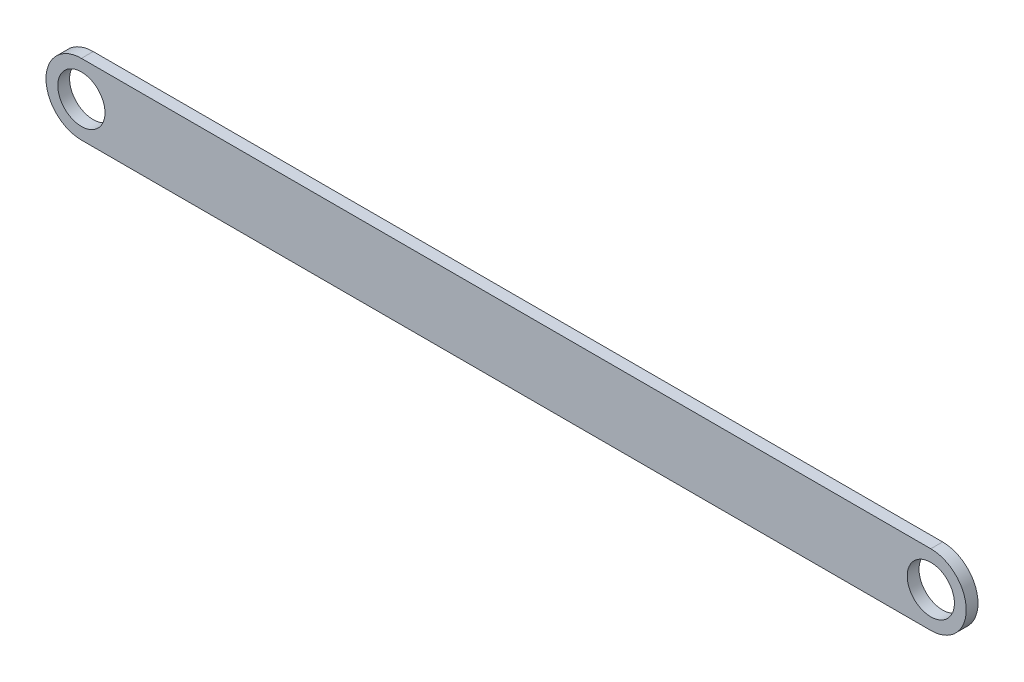
ISO-10303-21;
HEADER;
FILE_DESCRIPTION(('STEP AP214'),'2;1');
FILE_NAME('part.step','',(''),(''),'','','');
FILE_SCHEMA(('AUTOMOTIVE_DESIGN { 1 0 10303 214 1 1 1 1 }'));
ENDSEC;
DATA;
#1=APPLICATION_CONTEXT('core data for automotive mechanical design processes');
#2=APPLICATION_PROTOCOL_DEFINITION('international standard','automotive_design',2000,#1);
#3=PRODUCT_CONTEXT('',#1,'mechanical');
#4=PRODUCT('Part','Part','',(#3));
#5=PRODUCT_RELATED_PRODUCT_CATEGORY('part','',(#4));
#6=PRODUCT_DEFINITION_FORMATION('','',#4);
#7=PRODUCT_DEFINITION_CONTEXT('part definition',#1,'design');
#8=PRODUCT_DEFINITION('design','',#6,#7);
#9=PRODUCT_DEFINITION_SHAPE('','',#8);
#10=(LENGTH_UNIT() NAMED_UNIT(*) SI_UNIT(.MILLI.,.METRE.));
#11=(NAMED_UNIT(*) PLANE_ANGLE_UNIT() SI_UNIT($,.RADIAN.));
#12=(NAMED_UNIT(*) SI_UNIT($,.STERADIAN.) SOLID_ANGLE_UNIT());
#13=UNCERTAINTY_MEASURE_WITH_UNIT(LENGTH_MEASURE(1.E-05),#10,'distance_accuracy_value','');
#14=(GEOMETRIC_REPRESENTATION_CONTEXT(3) GLOBAL_UNCERTAINTY_ASSIGNED_CONTEXT((#13)) GLOBAL_UNIT_ASSIGNED_CONTEXT((#10,
#11,#12)) REPRESENTATION_CONTEXT('',''));
#15=CARTESIAN_POINT('',(0.,0.,0.));
#16=DIRECTION('',(0.,0.,1.));
#17=DIRECTION('',(1.,0.,0.));
#18=AXIS2_PLACEMENT_3D('',#15,#16,#17);
#19=CARTESIAN_POINT('',(-90.,0.,2.5));
#20=DIRECTION('',(0.,0.,-1.));
#21=DIRECTION('',(-1.,0.,0.));
#22=AXIS2_PLACEMENT_3D('',#19,#20,#21);
#23=CYLINDRICAL_SURFACE('',#22,7.5);
#24=CARTESIAN_POINT('',(-90.,0.,0.));
#25=DIRECTION('',(0.,0.,1.));
#26=DIRECTION('',(1.,0.,0.));
#27=AXIS2_PLACEMENT_3D('',#24,#25,#26);
#28=CIRCLE('',#27,7.5);
#29=CARTESIAN_POINT('',(-90.,7.5,0.));
#30=VERTEX_POINT('',#29);
#31=CARTESIAN_POINT('',(-90.,-7.5,0.));
#32=VERTEX_POINT('',#31);
#33=EDGE_CURVE('E102',#30,#32,#28,.T.);
#34=ORIENTED_EDGE('',*,*,#33,.T.);
#35=DIRECTION('',(0.,0.,-1.));
#36=VECTOR('',#35,1.);
#37=CARTESIAN_POINT('',(-90.,-7.5,2.5));
#38=LINE('',#37,#36);
#39=CARTESIAN_POINT('',(-90.,-7.5,2.5));
#40=VERTEX_POINT('',#39);
#41=EDGE_CURVE('E11',#40,#32,#38,.T.);
#42=ORIENTED_EDGE('',*,*,#41,.F.);
#43=CARTESIAN_POINT('',(-90.,0.,2.5));
#44=DIRECTION('',(0.,0.,1.));
#45=DIRECTION('',(1.,0.,0.));
#46=AXIS2_PLACEMENT_3D('',#43,#44,#45);
#47=CIRCLE('',#46,7.5);
#48=CARTESIAN_POINT('',(-90.,7.5,2.5));
#49=VERTEX_POINT('',#48);
#50=EDGE_CURVE('E90',#49,#40,#47,.T.);
#51=ORIENTED_EDGE('',*,*,#50,.F.);
#52=DIRECTION('',(0.,0.,-1.));
#53=VECTOR('',#52,1.);
#54=CARTESIAN_POINT('',(-90.,7.5,2.5));
#55=LINE('',#54,#53);
#56=EDGE_CURVE('E98',#49,#30,#55,.T.);
#57=ORIENTED_EDGE('',*,*,#56,.T.);
#58=EDGE_LOOP('',(#34,#42,#51,#57));
#59=FACE_BOUND('',#58,.T.);
#60=ADVANCED_FACE('F39',(#59),#23,.T.);
#61=CARTESIAN_POINT('',(-90.,-7.5,2.5));
#62=DIRECTION('',(0.,1.,0.));
#63=DIRECTION('',(-1.,0.,0.));
#64=AXIS2_PLACEMENT_3D('',#61,#62,#63);
#65=PLANE('',#64);
#66=DIRECTION('',(1.,0.,0.));
#67=VECTOR('',#66,1.);
#68=CARTESIAN_POINT('',(-90.,-7.5,0.));
#69=LINE('',#68,#67);
#70=CARTESIAN_POINT('',(90.,-7.49999999999997,0.));
#71=VERTEX_POINT('',#70);
#72=EDGE_CURVE('E94',#32,#71,#69,.T.);
#73=ORIENTED_EDGE('',*,*,#72,.T.);
#74=DIRECTION('',(0.,0.,-1.));
#75=VECTOR('',#74,1.);
#76=CARTESIAN_POINT('',(90.,-7.49999999999997,2.5));
#77=LINE('',#76,#75);
#78=CARTESIAN_POINT('',(90.,-7.49999999999997,2.5));
#79=VERTEX_POINT('',#78);
#80=EDGE_CURVE('E47',#79,#71,#77,.T.);
#81=ORIENTED_EDGE('',*,*,#80,.F.);
#82=DIRECTION('',(1.,0.,0.));
#83=VECTOR('',#82,1.);
#84=CARTESIAN_POINT('',(-90.,-7.5,2.5));
#85=LINE('',#84,#83);
#86=EDGE_CURVE('E85',#40,#79,#85,.T.);
#87=ORIENTED_EDGE('',*,*,#86,.F.);
#88=ORIENTED_EDGE('',*,*,#41,.T.);
#89=EDGE_LOOP('',(#73,#81,#87,#88));
#90=FACE_BOUND('',#89,.T.);
#91=ADVANCED_FACE('F93',(#90),#65,.F.);
#92=CARTESIAN_POINT('',(90.,0.,2.5));
#93=DIRECTION('',(0.,0.,-1.));
#94=DIRECTION('',(-1.,0.,0.));
#95=AXIS2_PLACEMENT_3D('',#92,#93,#94);
#96=CYLINDRICAL_SURFACE('',#95,7.5);
#97=CARTESIAN_POINT('',(90.,0.,0.));
#98=DIRECTION('',(0.,0.,1.));
#99=DIRECTION('',(1.,0.,0.));
#100=AXIS2_PLACEMENT_3D('',#97,#98,#99);
#101=CIRCLE('',#100,7.5);
#102=CARTESIAN_POINT('',(90.,7.50000000000003,0.));
#103=VERTEX_POINT('',#102);
#104=EDGE_CURVE('E72',#71,#103,#101,.T.);
#105=ORIENTED_EDGE('',*,*,#104,.T.);
#106=DIRECTION('',(0.,0.,-1.));
#107=VECTOR('',#106,1.);
#108=CARTESIAN_POINT('',(90.,7.50000000000003,2.5));
#109=LINE('',#108,#107);
#110=CARTESIAN_POINT('',(90.,7.50000000000003,2.5));
#111=VERTEX_POINT('',#110);
#112=EDGE_CURVE('E95',#111,#103,#109,.T.);
#113=ORIENTED_EDGE('',*,*,#112,.F.);
#114=CARTESIAN_POINT('',(90.,0.,2.5));
#115=DIRECTION('',(0.,0.,1.));
#116=DIRECTION('',(1.,0.,0.));
#117=AXIS2_PLACEMENT_3D('',#114,#115,#116);
#118=CIRCLE('',#117,7.5);
#119=EDGE_CURVE('E88',#79,#111,#118,.T.);
#120=ORIENTED_EDGE('',*,*,#119,.F.);
#121=ORIENTED_EDGE('',*,*,#80,.T.);
#122=EDGE_LOOP('',(#105,#113,#120,#121));
#123=FACE_BOUND('',#122,.T.);
#124=ADVANCED_FACE('F96',(#123),#96,.T.);
#125=CARTESIAN_POINT('',(-90.,7.5,2.5));
#126=DIRECTION('',(0.,-1.,0.));
#127=DIRECTION('',(1.,0.,0.));
#128=AXIS2_PLACEMENT_3D('',#125,#126,#127);
#129=PLANE('',#128);
#130=DIRECTION('',(-1.,0.,0.));
#131=VECTOR('',#130,1.);
#132=CARTESIAN_POINT('',(-90.,7.5,0.));
#133=LINE('',#132,#131);
#134=EDGE_CURVE('E78',#103,#30,#133,.T.);
#135=ORIENTED_EDGE('',*,*,#134,.T.);
#136=ORIENTED_EDGE('',*,*,#56,.F.);
#137=DIRECTION('',(-1.,0.,0.));
#138=VECTOR('',#137,1.);
#139=CARTESIAN_POINT('',(-90.,7.5,2.5));
#140=LINE('',#139,#138);
#141=EDGE_CURVE('E55',#111,#49,#140,.T.);
#142=ORIENTED_EDGE('',*,*,#141,.F.);
#143=ORIENTED_EDGE('',*,*,#112,.T.);
#144=EDGE_LOOP('',(#135,#136,#142,#143));
#145=FACE_BOUND('',#144,.T.);
#146=ADVANCED_FACE('F110',(#145),#129,.F.);
#147=CARTESIAN_POINT('',(-90.,0.,2.5));
#148=DIRECTION('',(0.,0.,1.));
#149=DIRECTION('',(1.,0.,0.));
#150=AXIS2_PLACEMENT_3D('',#147,#148,#149);
#151=PLANE('',#150);
#152=CARTESIAN_POINT('',(-90.,0.,2.5));
#153=DIRECTION('',(0.,0.,1.));
#154=DIRECTION('',(1.,0.,0.));
#155=AXIS2_PLACEMENT_3D('',#152,#153,#154);
#156=CIRCLE('',#155,5.);
#157=CARTESIAN_POINT('',(-85.,0.,2.5));
#158=VERTEX_POINT('',#157);
#159=EDGE_CURVE('E122',#158,#158,#156,.T.);
#160=ORIENTED_EDGE('',*,*,#159,.F.);
#161=EDGE_LOOP('',(#160));
#162=FACE_BOUND('',#161,.T.);
#163=CARTESIAN_POINT('',(90.,0.,2.5));
#164=DIRECTION('',(0.,0.,1.));
#165=DIRECTION('',(1.,0.,0.));
#166=AXIS2_PLACEMENT_3D('',#163,#164,#165);
#167=CIRCLE('',#166,5.);
#168=CARTESIAN_POINT('',(95.,0.,2.5));
#169=VERTEX_POINT('',#168);
#170=EDGE_CURVE('E116',#169,#169,#167,.T.);
#171=ORIENTED_EDGE('',*,*,#170,.F.);
#172=EDGE_LOOP('',(#171));
#173=FACE_BOUND('',#172,.T.);
#174=ORIENTED_EDGE('',*,*,#50,.T.);
#175=ORIENTED_EDGE('',*,*,#86,.T.);
#176=ORIENTED_EDGE('',*,*,#119,.T.);
#177=ORIENTED_EDGE('',*,*,#141,.T.);
#178=EDGE_LOOP('',(#174,#175,#176,#177));
#179=FACE_BOUND('',#178,.T.);
#180=ADVANCED_FACE('F86',(#162,#173,#179),#151,.T.);
#181=CARTESIAN_POINT('',(-90.,0.,0.));
#182=DIRECTION('',(0.,0.,1.));
#183=DIRECTION('',(1.,0.,0.));
#184=AXIS2_PLACEMENT_3D('',#181,#182,#183);
#185=PLANE('',#184);
#186=CARTESIAN_POINT('',(-90.,0.,0.));
#187=DIRECTION('',(0.,0.,1.));
#188=DIRECTION('',(1.,0.,0.));
#189=AXIS2_PLACEMENT_3D('',#186,#187,#188);
#190=CIRCLE('',#189,5.);
#191=CARTESIAN_POINT('',(-85.,0.,0.));
#192=VERTEX_POINT('',#191);
#193=EDGE_CURVE('E105',#192,#192,#190,.T.);
#194=ORIENTED_EDGE('',*,*,#193,.T.);
#195=EDGE_LOOP('',(#194));
#196=FACE_BOUND('',#195,.T.);
#197=CARTESIAN_POINT('',(90.,0.,0.));
#198=DIRECTION('',(0.,0.,1.));
#199=DIRECTION('',(1.,0.,0.));
#200=AXIS2_PLACEMENT_3D('',#197,#198,#199);
#201=CIRCLE('',#200,5.);
#202=CARTESIAN_POINT('',(95.,0.,0.));
#203=VERTEX_POINT('',#202);
#204=EDGE_CURVE('E119',#203,#203,#201,.T.);
#205=ORIENTED_EDGE('',*,*,#204,.T.);
#206=EDGE_LOOP('',(#205));
#207=FACE_BOUND('',#206,.T.);
#208=ORIENTED_EDGE('',*,*,#33,.F.);
#209=ORIENTED_EDGE('',*,*,#134,.F.);
#210=ORIENTED_EDGE('',*,*,#104,.F.);
#211=ORIENTED_EDGE('',*,*,#72,.F.);
#212=EDGE_LOOP('',(#208,#209,#210,#211));
#213=FACE_BOUND('',#212,.T.);
#214=ADVANCED_FACE('F113',(#196,#207,#213),#185,.F.);
#215=CARTESIAN_POINT('',(90.,0.,0.));
#216=DIRECTION('',(0.,0.,1.));
#217=DIRECTION('',(1.,0.,0.));
#218=AXIS2_PLACEMENT_3D('',#215,#216,#217);
#219=CYLINDRICAL_SURFACE('',#218,5.);
#220=ORIENTED_EDGE('',*,*,#204,.F.);
#221=EDGE_LOOP('',(#220));
#222=FACE_BOUND('',#221,.T.);
#223=ORIENTED_EDGE('',*,*,#170,.T.);
#224=EDGE_LOOP('',(#223));
#225=FACE_BOUND('',#224,.T.);
#226=ADVANCED_FACE('F133',(#222,#225),#219,.F.);
#227=CARTESIAN_POINT('',(-90.,0.,0.));
#228=DIRECTION('',(0.,0.,1.));
#229=DIRECTION('',(1.,0.,0.));
#230=AXIS2_PLACEMENT_3D('',#227,#228,#229);
#231=CYLINDRICAL_SURFACE('',#230,5.);
#232=ORIENTED_EDGE('',*,*,#193,.F.);
#233=EDGE_LOOP('',(#232));
#234=FACE_BOUND('',#233,.T.);
#235=ORIENTED_EDGE('',*,*,#159,.T.);
#236=EDGE_LOOP('',(#235));
#237=FACE_BOUND('',#236,.T.);
#238=ADVANCED_FACE('F130',(#234,#237),#231,.F.);
#239=CLOSED_SHELL('',(#60,#91,#124,#146,#180,#214,#226,#238));
#240=MANIFOLD_SOLID_BREP('B2',#239);
#241=ADVANCED_BREP_SHAPE_REPRESENTATION('',(#18,#240),#14);
#242=SHAPE_DEFINITION_REPRESENTATION(#9,#241);
ENDSEC;
END-ISO-10303-21;
